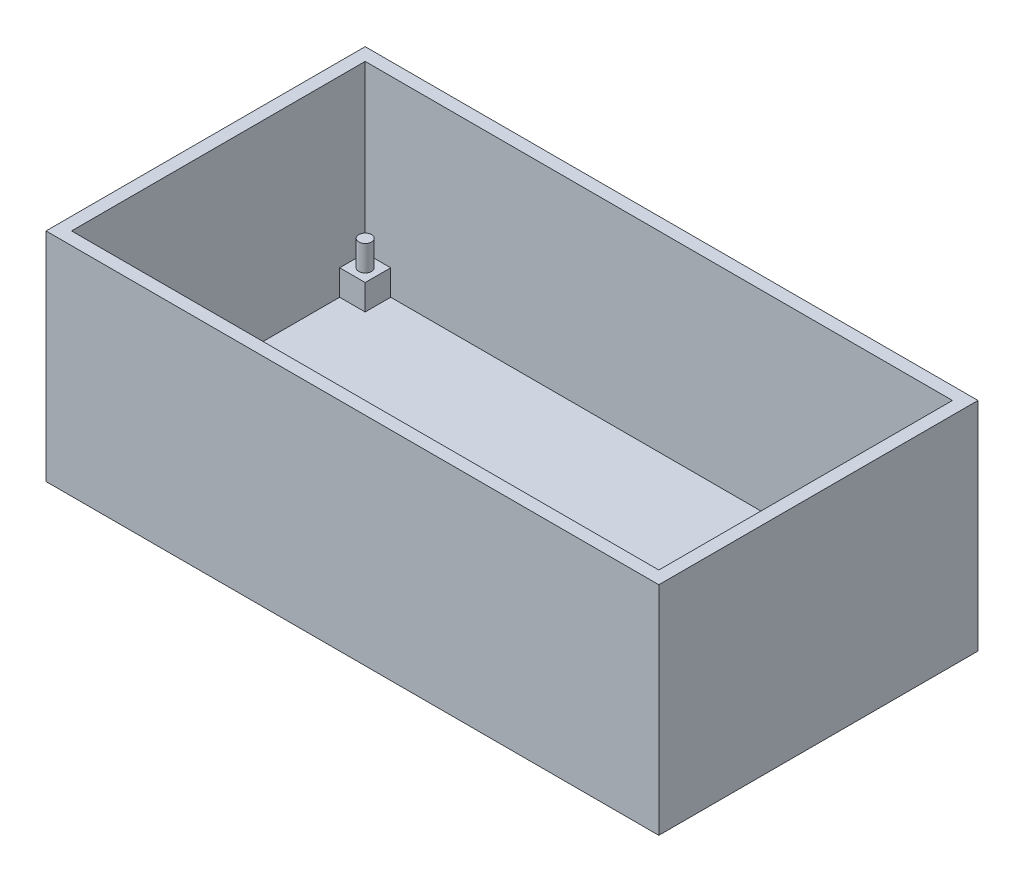
ISO-10303-21;
HEADER;
FILE_DESCRIPTION(('STEP AP214'),'2;1');
FILE_NAME('part.step','',(''),(''),'','','');
FILE_SCHEMA(('AUTOMOTIVE_DESIGN { 1 0 10303 214 1 1 1 1 }'));
ENDSEC;
DATA;
#1=APPLICATION_CONTEXT('core data for automotive mechanical design processes');
#2=APPLICATION_PROTOCOL_DEFINITION('international standard','automotive_design',2000,#1);
#3=PRODUCT_CONTEXT('',#1,'mechanical');
#4=PRODUCT('Part','Part','',(#3));
#5=PRODUCT_RELATED_PRODUCT_CATEGORY('part','',(#4));
#6=PRODUCT_DEFINITION_FORMATION('','',#4);
#7=PRODUCT_DEFINITION_CONTEXT('part definition',#1,'design');
#8=PRODUCT_DEFINITION('design','',#6,#7);
#9=PRODUCT_DEFINITION_SHAPE('','',#8);
#10=(LENGTH_UNIT() NAMED_UNIT(*) SI_UNIT(.MILLI.,.METRE.));
#11=(NAMED_UNIT(*) PLANE_ANGLE_UNIT() SI_UNIT($,.RADIAN.));
#12=(NAMED_UNIT(*) SI_UNIT($,.STERADIAN.) SOLID_ANGLE_UNIT());
#13=UNCERTAINTY_MEASURE_WITH_UNIT(LENGTH_MEASURE(1.E-05),#10,'distance_accuracy_value','');
#14=(GEOMETRIC_REPRESENTATION_CONTEXT(3) GLOBAL_UNCERTAINTY_ASSIGNED_CONTEXT((#13)) GLOBAL_UNIT_ASSIGNED_CONTEXT((#10,
#11,#12)) REPRESENTATION_CONTEXT('',''));
#15=CARTESIAN_POINT('',(0.,0.,0.));
#16=DIRECTION('',(0.,0.,1.));
#17=DIRECTION('',(1.,0.,0.));
#18=AXIS2_PLACEMENT_3D('',#15,#16,#17);
#19=CARTESIAN_POINT('',(0.,5.08,0.));
#20=DIRECTION('',(0.,-1.,0.));
#21=DIRECTION('',(0.,0.,-1.));
#22=AXIS2_PLACEMENT_3D('',#19,#20,#21);
#23=PLANE('',#22);
#24=DIRECTION('',(0.,0.,-1.));
#25=VECTOR('',#24,1.);
#26=CARTESIAN_POINT('',(7.62,5.08,-2.54));
#27=LINE('',#26,#25);
#28=CARTESIAN_POINT('',(7.62,5.08,-2.54));
#29=VERTEX_POINT('',#28);
#30=CARTESIAN_POINT('',(7.62,5.08,-7.62));
#31=VERTEX_POINT('',#30);
#32=EDGE_CURVE('E185',#29,#31,#27,.T.);
#33=ORIENTED_EDGE('',*,*,#32,.F.);
#34=DIRECTION('',(1.,0.,0.));
#35=VECTOR('',#34,1.);
#36=CARTESIAN_POINT('',(2.54000000000001,5.08,-2.54));
#37=LINE('',#36,#35);
#38=CARTESIAN_POINT('',(114.3,5.08,-2.54));
#39=VERTEX_POINT('',#38);
#40=EDGE_CURVE('E291',#29,#39,#37,.T.);
#41=ORIENTED_EDGE('',*,*,#40,.T.);
#42=DIRECTION('',(0.,0.,1.));
#43=VECTOR('',#42,1.);
#44=CARTESIAN_POINT('',(114.3,5.08,-2.53999999999997));
#45=LINE('',#44,#43);
#46=CARTESIAN_POINT('',(114.3,5.08,-7.61999999999997));
#47=VERTEX_POINT('',#46);
#48=EDGE_CURVE('E205',#47,#39,#45,.T.);
#49=ORIENTED_EDGE('',*,*,#48,.F.);
#50=DIRECTION('',(-1.,0.,0.));
#51=VECTOR('',#50,1.);
#52=CARTESIAN_POINT('',(119.38,5.08,-7.61999999999997));
#53=LINE('',#52,#51);
#54=CARTESIAN_POINT('',(119.38,5.08,-7.61999999999997));
#55=VERTEX_POINT('',#54);
#56=EDGE_CURVE('E200',#55,#47,#53,.T.);
#57=ORIENTED_EDGE('',*,*,#56,.F.);
#58=DIRECTION('',(0.,0.,-1.));
#59=VECTOR('',#58,1.);
#60=CARTESIAN_POINT('',(119.38,5.08,-60.96));
#61=LINE('',#60,#59);
#62=CARTESIAN_POINT('',(119.38,5.08,-55.88));
#63=VERTEX_POINT('',#62);
#64=EDGE_CURVE('E293',#55,#63,#61,.T.);
#65=ORIENTED_EDGE('',*,*,#64,.T.);
#66=DIRECTION('',(1.,0.,0.));
#67=VECTOR('',#66,1.);
#68=CARTESIAN_POINT('',(119.38,5.08,-55.88));
#69=LINE('',#68,#67);
#70=CARTESIAN_POINT('',(114.3,5.08,-55.88));
#71=VERTEX_POINT('',#70);
#72=EDGE_CURVE('E231',#71,#63,#69,.T.);
#73=ORIENTED_EDGE('',*,*,#72,.F.);
#74=DIRECTION('',(0.,0.,1.));
#75=VECTOR('',#74,1.);
#76=CARTESIAN_POINT('',(114.3,5.08,-60.96));
#77=LINE('',#76,#75);
#78=CARTESIAN_POINT('',(114.3,5.08,-60.96));
#79=VERTEX_POINT('',#78);
#80=EDGE_CURVE('E226',#79,#71,#77,.T.);
#81=ORIENTED_EDGE('',*,*,#80,.F.);
#82=DIRECTION('',(-1.,0.,0.));
#83=VECTOR('',#82,1.);
#84=CARTESIAN_POINT('',(2.54,5.08,-60.96));
#85=LINE('',#84,#83);
#86=CARTESIAN_POINT('',(7.62,5.08,-60.96));
#87=VERTEX_POINT('',#86);
#88=EDGE_CURVE('E282',#79,#87,#85,.T.);
#89=ORIENTED_EDGE('',*,*,#88,.T.);
#90=DIRECTION('',(0.,0.,-1.));
#91=VECTOR('',#90,1.);
#92=CARTESIAN_POINT('',(7.62,5.08,-60.96));
#93=LINE('',#92,#91);
#94=CARTESIAN_POINT('',(7.62,5.08,-55.88));
#95=VERTEX_POINT('',#94);
#96=EDGE_CURVE('E257',#95,#87,#93,.T.);
#97=ORIENTED_EDGE('',*,*,#96,.F.);
#98=DIRECTION('',(1.,0.,0.));
#99=VECTOR('',#98,1.);
#100=CARTESIAN_POINT('',(2.54,5.08,-55.88));
#101=LINE('',#100,#99);
#102=CARTESIAN_POINT('',(2.54,5.08,-55.88));
#103=VERTEX_POINT('',#102);
#104=EDGE_CURVE('E252',#103,#95,#101,.T.);
#105=ORIENTED_EDGE('',*,*,#104,.F.);
#106=DIRECTION('',(0.,0.,1.));
#107=VECTOR('',#106,1.);
#108=CARTESIAN_POINT('',(2.54,5.08,-60.96));
#109=LINE('',#108,#107);
#110=CARTESIAN_POINT('',(2.54000000000001,5.08,-7.62));
#111=VERTEX_POINT('',#110);
#112=EDGE_CURVE('E278',#103,#111,#109,.T.);
#113=ORIENTED_EDGE('',*,*,#112,.T.);
#114=DIRECTION('',(-1.,0.,0.));
#115=VECTOR('',#114,1.);
#116=CARTESIAN_POINT('',(2.54,5.08,-7.62));
#117=LINE('',#116,#115);
#118=EDGE_CURVE('E47',#31,#111,#117,.T.);
#119=ORIENTED_EDGE('',*,*,#118,.F.);
#120=EDGE_LOOP('',(#33,#41,#49,#57,#65,#73,#81,#89,#97,#105,#113,#119));
#121=FACE_BOUND('',#120,.T.);
#122=ADVANCED_FACE('F32',(#121),#23,.F.);
#123=CARTESIAN_POINT('',(2.54000000000001,43.18,-2.54));
#124=DIRECTION('',(0.,0.,-1.));
#125=DIRECTION('',(-1.,0.,0.));
#126=AXIS2_PLACEMENT_3D('',#123,#124,#125);
#127=PLANE('',#126);
#128=ORIENTED_EDGE('',*,*,#40,.F.);
#129=DIRECTION('',(0.,-1.,0.));
#130=VECTOR('',#129,1.);
#131=CARTESIAN_POINT('',(7.62,10.16,-2.54));
#132=LINE('',#131,#130);
#133=CARTESIAN_POINT('',(7.62,10.16,-2.54));
#134=VERTEX_POINT('',#133);
#135=EDGE_CURVE('E55',#134,#29,#132,.T.);
#136=ORIENTED_EDGE('',*,*,#135,.F.);
#137=DIRECTION('',(1.,0.,0.));
#138=VECTOR('',#137,1.);
#139=CARTESIAN_POINT('',(2.54,10.16,-2.54));
#140=LINE('',#139,#138);
#141=CARTESIAN_POINT('',(2.54,10.16,-2.54));
#142=VERTEX_POINT('',#141);
#143=EDGE_CURVE('E179',#142,#134,#140,.T.);
#144=ORIENTED_EDGE('',*,*,#143,.F.);
#145=DIRECTION('',(0.,-1.,0.));
#146=VECTOR('',#145,1.);
#147=CARTESIAN_POINT('',(2.54000000000001,43.18,-2.54));
#148=LINE('',#147,#146);
#149=CARTESIAN_POINT('',(2.54000000000001,43.18,-2.54));
#150=VERTEX_POINT('',#149);
#151=EDGE_CURVE('E302',#150,#142,#148,.T.);
#152=ORIENTED_EDGE('',*,*,#151,.F.);
#153=DIRECTION('',(1.,0.,0.));
#154=VECTOR('',#153,1.);
#155=CARTESIAN_POINT('',(2.54000000000001,43.18,-2.54));
#156=LINE('',#155,#154);
#157=CARTESIAN_POINT('',(119.38,43.18,-2.54));
#158=VERTEX_POINT('',#157);
#159=EDGE_CURVE('E281',#150,#158,#156,.T.);
#160=ORIENTED_EDGE('',*,*,#159,.T.);
#161=DIRECTION('',(0.,-1.,0.));
#162=VECTOR('',#161,1.);
#163=CARTESIAN_POINT('',(119.38,43.18,-2.54));
#164=LINE('',#163,#162);
#165=CARTESIAN_POINT('',(119.38,10.16,-2.53999999999997));
#166=VERTEX_POINT('',#165);
#167=EDGE_CURVE('E300',#158,#166,#164,.T.);
#168=ORIENTED_EDGE('',*,*,#167,.T.);
#169=DIRECTION('',(1.,0.,0.));
#170=VECTOR('',#169,1.);
#171=CARTESIAN_POINT('',(119.38,10.16,-2.53999999999997));
#172=LINE('',#171,#170);
#173=CARTESIAN_POINT('',(114.3,10.16,-2.54));
#174=VERTEX_POINT('',#173);
#175=EDGE_CURVE('E210',#174,#166,#172,.T.);
#176=ORIENTED_EDGE('',*,*,#175,.F.);
#177=DIRECTION('',(0.,-1.,0.));
#178=VECTOR('',#177,1.);
#179=CARTESIAN_POINT('',(114.3,10.16,-2.53999999999997));
#180=LINE('',#179,#178);
#181=EDGE_CURVE('E213',#174,#39,#180,.T.);
#182=ORIENTED_EDGE('',*,*,#181,.T.);
#183=EDGE_LOOP('',(#128,#136,#144,#152,#160,#168,#176,#182));
#184=FACE_BOUND('',#183,.T.);
#185=ADVANCED_FACE('F358',(#184),#127,.T.);
#186=CARTESIAN_POINT('',(2.54,43.18,-60.96));
#187=DIRECTION('',(1.,0.,0.));
#188=DIRECTION('',(0.,0.,-1.));
#189=AXIS2_PLACEMENT_3D('',#186,#187,#188);
#190=PLANE('',#189);
#191=DIRECTION('',(0.,0.,1.));
#192=VECTOR('',#191,1.);
#193=CARTESIAN_POINT('',(2.54,10.16,-2.54));
#194=LINE('',#193,#192);
#195=CARTESIAN_POINT('',(2.54000000000001,10.16,-7.62));
#196=VERTEX_POINT('',#195);
#197=EDGE_CURVE('E190',#196,#142,#194,.T.);
#198=ORIENTED_EDGE('',*,*,#197,.F.);
#199=DIRECTION('',(0.,-1.,0.));
#200=VECTOR('',#199,1.);
#201=CARTESIAN_POINT('',(2.54,10.16,-7.62));
#202=LINE('',#201,#200);
#203=EDGE_CURVE('E187',#196,#111,#202,.T.);
#204=ORIENTED_EDGE('',*,*,#203,.T.);
#205=ORIENTED_EDGE('',*,*,#112,.F.);
#206=DIRECTION('',(0.,-1.,0.));
#207=VECTOR('',#206,1.);
#208=CARTESIAN_POINT('',(2.54,10.16,-55.88));
#209=LINE('',#208,#207);
#210=CARTESIAN_POINT('',(2.54,10.16,-55.88));
#211=VERTEX_POINT('',#210);
#212=EDGE_CURVE('E275',#211,#103,#209,.T.);
#213=ORIENTED_EDGE('',*,*,#212,.F.);
#214=DIRECTION('',(0.,0.,1.));
#215=VECTOR('',#214,1.);
#216=CARTESIAN_POINT('',(2.54,10.16,-60.96));
#217=LINE('',#216,#215);
#218=CARTESIAN_POINT('',(2.54,10.16,-60.96));
#219=VERTEX_POINT('',#218);
#220=EDGE_CURVE('E253',#219,#211,#217,.T.);
#221=ORIENTED_EDGE('',*,*,#220,.F.);
#222=DIRECTION('',(0.,-1.,0.));
#223=VECTOR('',#222,1.);
#224=CARTESIAN_POINT('',(2.54,43.18,-60.96));
#225=LINE('',#224,#223);
#226=CARTESIAN_POINT('',(2.54,43.18,-60.96));
#227=VERTEX_POINT('',#226);
#228=EDGE_CURVE('E289',#227,#219,#225,.T.);
#229=ORIENTED_EDGE('',*,*,#228,.F.);
#230=DIRECTION('',(0.,0.,1.));
#231=VECTOR('',#230,1.);
#232=CARTESIAN_POINT('',(2.54,43.18,-60.96));
#233=LINE('',#232,#231);
#234=EDGE_CURVE('E279',#227,#150,#233,.T.);
#235=ORIENTED_EDGE('',*,*,#234,.T.);
#236=ORIENTED_EDGE('',*,*,#151,.T.);
#237=EDGE_LOOP('',(#198,#204,#205,#213,#221,#229,#235,#236));
#238=FACE_BOUND('',#237,.T.);
#239=ADVANCED_FACE('F363',(#238),#190,.T.);
#240=CARTESIAN_POINT('',(119.38,43.18,-60.96));
#241=DIRECTION('',(-1.,0.,0.));
#242=DIRECTION('',(0.,0.,1.));
#243=AXIS2_PLACEMENT_3D('',#240,#241,#242);
#244=PLANE('',#243);
#245=ORIENTED_EDGE('',*,*,#64,.F.);
#246=DIRECTION('',(0.,-1.,0.));
#247=VECTOR('',#246,1.);
#248=CARTESIAN_POINT('',(119.38,10.16,-7.61999999999997));
#249=LINE('',#248,#247);
#250=CARTESIAN_POINT('',(119.38,10.16,-7.61999999999997));
#251=VERTEX_POINT('',#250);
#252=EDGE_CURVE('E223',#251,#55,#249,.T.);
#253=ORIENTED_EDGE('',*,*,#252,.F.);
#254=DIRECTION('',(0.,0.,-1.));
#255=VECTOR('',#254,1.);
#256=CARTESIAN_POINT('',(119.38,10.16,-2.53999999999997));
#257=LINE('',#256,#255);
#258=EDGE_CURVE('E201',#166,#251,#257,.T.);
#259=ORIENTED_EDGE('',*,*,#258,.F.);
#260=ORIENTED_EDGE('',*,*,#167,.F.);
#261=DIRECTION('',(0.,0.,-1.));
#262=VECTOR('',#261,1.);
#263=CARTESIAN_POINT('',(119.38,43.18,-60.96));
#264=LINE('',#263,#262);
#265=CARTESIAN_POINT('',(119.38,43.18,-60.96));
#266=VERTEX_POINT('',#265);
#267=EDGE_CURVE('E284',#158,#266,#264,.T.);
#268=ORIENTED_EDGE('',*,*,#267,.T.);
#269=DIRECTION('',(0.,-1.,0.));
#270=VECTOR('',#269,1.);
#271=CARTESIAN_POINT('',(119.38,43.18,-60.96));
#272=LINE('',#271,#270);
#273=CARTESIAN_POINT('',(119.38,10.16,-60.96));
#274=VERTEX_POINT('',#273);
#275=EDGE_CURVE('E298',#266,#274,#272,.T.);
#276=ORIENTED_EDGE('',*,*,#275,.T.);
#277=DIRECTION('',(0.,0.,-1.));
#278=VECTOR('',#277,1.);
#279=CARTESIAN_POINT('',(119.38,10.16,-60.96));
#280=LINE('',#279,#278);
#281=CARTESIAN_POINT('',(119.38,10.16,-55.88));
#282=VERTEX_POINT('',#281);
#283=EDGE_CURVE('E236',#282,#274,#280,.T.);
#284=ORIENTED_EDGE('',*,*,#283,.F.);
#285=DIRECTION('',(0.,-1.,0.));
#286=VECTOR('',#285,1.);
#287=CARTESIAN_POINT('',(119.38,10.16,-55.88));
#288=LINE('',#287,#286);
#289=EDGE_CURVE('E239',#282,#63,#288,.T.);
#290=ORIENTED_EDGE('',*,*,#289,.T.);
#291=EDGE_LOOP('',(#245,#253,#259,#260,#268,#276,#284,#290));
#292=FACE_BOUND('',#291,.T.);
#293=ADVANCED_FACE('F598',(#292),#244,.T.);
#294=CARTESIAN_POINT('',(2.54,43.18,-60.96));
#295=DIRECTION('',(0.,0.,1.));
#296=DIRECTION('',(1.,0.,0.));
#297=AXIS2_PLACEMENT_3D('',#294,#295,#296);
#298=PLANE('',#297);
#299=ORIENTED_EDGE('',*,*,#88,.F.);
#300=DIRECTION('',(0.,-1.,0.));
#301=VECTOR('',#300,1.);
#302=CARTESIAN_POINT('',(114.3,10.16,-60.96));
#303=LINE('',#302,#301);
#304=CARTESIAN_POINT('',(114.3,10.16,-60.96));
#305=VERTEX_POINT('',#304);
#306=EDGE_CURVE('E249',#305,#79,#303,.T.);
#307=ORIENTED_EDGE('',*,*,#306,.F.);
#308=DIRECTION('',(-1.,0.,0.));
#309=VECTOR('',#308,1.);
#310=CARTESIAN_POINT('',(119.38,10.16,-60.96));
#311=LINE('',#310,#309);
#312=EDGE_CURVE('E227',#274,#305,#311,.T.);
#313=ORIENTED_EDGE('',*,*,#312,.F.);
#314=ORIENTED_EDGE('',*,*,#275,.F.);
#315=DIRECTION('',(-1.,0.,0.));
#316=VECTOR('',#315,1.);
#317=CARTESIAN_POINT('',(2.54,43.18,-60.96));
#318=LINE('',#317,#316);
#319=EDGE_CURVE('E287',#266,#227,#318,.T.);
#320=ORIENTED_EDGE('',*,*,#319,.T.);
#321=ORIENTED_EDGE('',*,*,#228,.T.);
#322=DIRECTION('',(-1.,0.,0.));
#323=VECTOR('',#322,1.);
#324=CARTESIAN_POINT('',(2.54,10.16,-60.96));
#325=LINE('',#324,#323);
#326=CARTESIAN_POINT('',(7.62,10.16,-60.96));
#327=VERTEX_POINT('',#326);
#328=EDGE_CURVE('E262',#327,#219,#325,.T.);
#329=ORIENTED_EDGE('',*,*,#328,.F.);
#330=DIRECTION('',(0.,-1.,0.));
#331=VECTOR('',#330,1.);
#332=CARTESIAN_POINT('',(7.62,10.16,-60.96));
#333=LINE('',#332,#331);
#334=EDGE_CURVE('E265',#327,#87,#333,.T.);
#335=ORIENTED_EDGE('',*,*,#334,.T.);
#336=EDGE_LOOP('',(#299,#307,#313,#314,#320,#321,#329,#335));
#337=FACE_BOUND('',#336,.T.);
#338=ADVANCED_FACE('F356',(#337),#298,.T.);
#339=CARTESIAN_POINT('',(0.,5.08,0.));
#340=DIRECTION('',(1.,0.,0.));
#341=DIRECTION('',(0.,0.,-1.));
#342=AXIS2_PLACEMENT_3D('',#339,#340,#341);
#343=PLANE('',#342);
#344=DIRECTION('',(0.,0.,1.));
#345=VECTOR('',#344,1.);
#346=CARTESIAN_POINT('',(0.,0.,0.));
#347=LINE('',#346,#345);
#348=CARTESIAN_POINT('',(0.,0.,-63.5));
#349=VERTEX_POINT('',#348);
#350=CARTESIAN_POINT('',(0.,0.,0.));
#351=VERTEX_POINT('',#350);
#352=EDGE_CURVE('E316',#349,#351,#347,.T.);
#353=ORIENTED_EDGE('',*,*,#352,.T.);
#354=DIRECTION('',(0.,-1.,0.));
#355=VECTOR('',#354,1.);
#356=CARTESIAN_POINT('',(0.,5.08,0.));
#357=LINE('',#356,#355);
#358=CARTESIAN_POINT('',(0.,43.18,0.));
#359=VERTEX_POINT('',#358);
#360=EDGE_CURVE('E11',#359,#351,#357,.T.);
#361=ORIENTED_EDGE('',*,*,#360,.F.);
#362=DIRECTION('',(0.,0.,1.));
#363=VECTOR('',#362,1.);
#364=CARTESIAN_POINT('',(0.,43.18,-63.5));
#365=LINE('',#364,#363);
#366=CARTESIAN_POINT('',(0.,43.18,-63.5));
#367=VERTEX_POINT('',#366);
#368=EDGE_CURVE('E304',#367,#359,#365,.T.);
#369=ORIENTED_EDGE('',*,*,#368,.F.);
#370=DIRECTION('',(0.,-1.,0.));
#371=VECTOR('',#370,1.);
#372=CARTESIAN_POINT('',(0.,5.08,-63.5));
#373=LINE('',#372,#371);
#374=EDGE_CURVE('E325',#367,#349,#373,.T.);
#375=ORIENTED_EDGE('',*,*,#374,.T.);
#376=EDGE_LOOP('',(#353,#361,#369,#375));
#377=FACE_BOUND('',#376,.T.);
#378=ADVANCED_FACE('F34',(#377),#343,.F.);
#379=CARTESIAN_POINT('',(0.,5.08,0.));
#380=DIRECTION('',(0.,0.,-1.));
#381=DIRECTION('',(-1.,0.,0.));
#382=AXIS2_PLACEMENT_3D('',#379,#380,#381);
#383=PLANE('',#382);
#384=DIRECTION('',(1.,0.,0.));
#385=VECTOR('',#384,1.);
#386=CARTESIAN_POINT('',(0.,0.,0.));
#387=LINE('',#386,#385);
#388=CARTESIAN_POINT('',(121.92,0.,0.));
#389=VERTEX_POINT('',#388);
#390=EDGE_CURVE('E319',#351,#389,#387,.T.);
#391=ORIENTED_EDGE('',*,*,#390,.T.);
#392=DIRECTION('',(0.,-1.,0.));
#393=VECTOR('',#392,1.);
#394=CARTESIAN_POINT('',(121.92,5.08,0.));
#395=LINE('',#394,#393);
#396=CARTESIAN_POINT('',(121.92,43.18,0.));
#397=VERTEX_POINT('',#396);
#398=EDGE_CURVE('E40',#397,#389,#395,.T.);
#399=ORIENTED_EDGE('',*,*,#398,.F.);
#400=DIRECTION('',(1.,0.,0.));
#401=VECTOR('',#400,1.);
#402=CARTESIAN_POINT('',(0.,43.18,0.));
#403=LINE('',#402,#401);
#404=EDGE_CURVE('E307',#359,#397,#403,.T.);
#405=ORIENTED_EDGE('',*,*,#404,.F.);
#406=ORIENTED_EDGE('',*,*,#360,.T.);
#407=EDGE_LOOP('',(#391,#399,#405,#406));
#408=FACE_BOUND('',#407,.T.);
#409=ADVANCED_FACE('F349',(#408),#383,.F.);
#410=CARTESIAN_POINT('',(121.92,5.08,0.));
#411=DIRECTION('',(-1.,0.,0.));
#412=DIRECTION('',(0.,0.,1.));
#413=AXIS2_PLACEMENT_3D('',#410,#411,#412);
#414=PLANE('',#413);
#415=DIRECTION('',(0.,0.,-1.));
#416=VECTOR('',#415,1.);
#417=CARTESIAN_POINT('',(121.92,0.,0.));
#418=LINE('',#417,#416);
#419=CARTESIAN_POINT('',(121.92,0.,-63.5));
#420=VERTEX_POINT('',#419);
#421=EDGE_CURVE('E321',#389,#420,#418,.T.);
#422=ORIENTED_EDGE('',*,*,#421,.T.);
#423=DIRECTION('',(0.,-1.,0.));
#424=VECTOR('',#423,1.);
#425=CARTESIAN_POINT('',(121.92,5.08,-63.5));
#426=LINE('',#425,#424);
#427=CARTESIAN_POINT('',(121.92,43.18,-63.5));
#428=VERTEX_POINT('',#427);
#429=EDGE_CURVE('E328',#428,#420,#426,.T.);
#430=ORIENTED_EDGE('',*,*,#429,.F.);
#431=DIRECTION('',(0.,0.,-1.));
#432=VECTOR('',#431,1.);
#433=CARTESIAN_POINT('',(121.92,43.18,-63.5));
#434=LINE('',#433,#432);
#435=EDGE_CURVE('E310',#397,#428,#434,.T.);
#436=ORIENTED_EDGE('',*,*,#435,.F.);
#437=ORIENTED_EDGE('',*,*,#398,.T.);
#438=EDGE_LOOP('',(#422,#430,#436,#437));
#439=FACE_BOUND('',#438,.T.);
#440=ADVANCED_FACE('F334',(#439),#414,.F.);
#441=CARTESIAN_POINT('',(0.,5.08,-63.5));
#442=DIRECTION('',(0.,0.,1.));
#443=DIRECTION('',(1.,0.,0.));
#444=AXIS2_PLACEMENT_3D('',#441,#442,#443);
#445=PLANE('',#444);
#446=DIRECTION('',(-1.,0.,0.));
#447=VECTOR('',#446,1.);
#448=CARTESIAN_POINT('',(0.,0.,-63.5));
#449=LINE('',#448,#447);
#450=EDGE_CURVE('E323',#420,#349,#449,.T.);
#451=ORIENTED_EDGE('',*,*,#450,.T.);
#452=ORIENTED_EDGE('',*,*,#374,.F.);
#453=DIRECTION('',(-1.,0.,0.));
#454=VECTOR('',#453,1.);
#455=CARTESIAN_POINT('',(0.,43.18,-63.5));
#456=LINE('',#455,#454);
#457=EDGE_CURVE('E313',#428,#367,#456,.T.);
#458=ORIENTED_EDGE('',*,*,#457,.F.);
#459=ORIENTED_EDGE('',*,*,#429,.T.);
#460=EDGE_LOOP('',(#451,#452,#458,#459));
#461=FACE_BOUND('',#460,.T.);
#462=ADVANCED_FACE('F342',(#461),#445,.F.);
#463=CARTESIAN_POINT('',(0.,0.,0.));
#464=DIRECTION('',(0.,-1.,0.));
#465=DIRECTION('',(0.,0.,-1.));
#466=AXIS2_PLACEMENT_3D('',#463,#464,#465);
#467=PLANE('',#466);
#468=ORIENTED_EDGE('',*,*,#352,.F.);
#469=ORIENTED_EDGE('',*,*,#450,.F.);
#470=ORIENTED_EDGE('',*,*,#421,.F.);
#471=ORIENTED_EDGE('',*,*,#390,.F.);
#472=EDGE_LOOP('',(#468,#469,#470,#471));
#473=FACE_BOUND('',#472,.T.);
#474=ADVANCED_FACE('F340',(#473),#467,.T.);
#475=CARTESIAN_POINT('',(0.,43.18,0.));
#476=DIRECTION('',(0.,1.,0.));
#477=DIRECTION('',(0.,0.,1.));
#478=AXIS2_PLACEMENT_3D('',#475,#476,#477);
#479=PLANE('',#478);
#480=ORIENTED_EDGE('',*,*,#368,.T.);
#481=ORIENTED_EDGE('',*,*,#404,.T.);
#482=ORIENTED_EDGE('',*,*,#435,.T.);
#483=ORIENTED_EDGE('',*,*,#457,.T.);
#484=EDGE_LOOP('',(#480,#481,#482,#483));
#485=FACE_BOUND('',#484,.T.);
#486=ORIENTED_EDGE('',*,*,#159,.F.);
#487=ORIENTED_EDGE('',*,*,#234,.F.);
#488=ORIENTED_EDGE('',*,*,#319,.F.);
#489=ORIENTED_EDGE('',*,*,#267,.F.);
#490=EDGE_LOOP('',(#486,#487,#488,#489));
#491=FACE_BOUND('',#490,.T.);
#492=ADVANCED_FACE('F347',(#485,#491),#479,.T.);
#493=CARTESIAN_POINT('',(2.54,10.16,-55.88));
#494=DIRECTION('',(0.,0.,-1.));
#495=DIRECTION('',(-1.,0.,0.));
#496=AXIS2_PLACEMENT_3D('',#493,#494,#495);
#497=PLANE('',#496);
#498=ORIENTED_EDGE('',*,*,#104,.T.);
#499=DIRECTION('',(0.,-1.,0.));
#500=VECTOR('',#499,1.);
#501=CARTESIAN_POINT('',(7.62,10.16,-55.88));
#502=LINE('',#501,#500);
#503=CARTESIAN_POINT('',(7.62,10.16,-55.88));
#504=VERTEX_POINT('',#503);
#505=EDGE_CURVE('E272',#504,#95,#502,.T.);
#506=ORIENTED_EDGE('',*,*,#505,.F.);
#507=DIRECTION('',(1.,0.,0.));
#508=VECTOR('',#507,1.);
#509=CARTESIAN_POINT('',(2.54,10.16,-55.88));
#510=LINE('',#509,#508);
#511=EDGE_CURVE('E256',#211,#504,#510,.T.);
#512=ORIENTED_EDGE('',*,*,#511,.F.);
#513=ORIENTED_EDGE('',*,*,#212,.T.);
#514=EDGE_LOOP('',(#498,#506,#512,#513));
#515=FACE_BOUND('',#514,.T.);
#516=ADVANCED_FACE('F386',(#515),#497,.F.);
#517=CARTESIAN_POINT('',(7.62,10.16,-60.96));
#518=DIRECTION('',(-1.,0.,0.));
#519=DIRECTION('',(0.,0.,1.));
#520=AXIS2_PLACEMENT_3D('',#517,#518,#519);
#521=PLANE('',#520);
#522=ORIENTED_EDGE('',*,*,#96,.T.);
#523=ORIENTED_EDGE('',*,*,#334,.F.);
#524=DIRECTION('',(0.,0.,-1.));
#525=VECTOR('',#524,1.);
#526=CARTESIAN_POINT('',(7.62,10.16,-60.96));
#527=LINE('',#526,#525);
#528=EDGE_CURVE('E259',#504,#327,#527,.T.);
#529=ORIENTED_EDGE('',*,*,#528,.F.);
#530=ORIENTED_EDGE('',*,*,#505,.T.);
#531=EDGE_LOOP('',(#522,#523,#529,#530));
#532=FACE_BOUND('',#531,.T.);
#533=ADVANCED_FACE('F392',(#532),#521,.F.);
#534=CARTESIAN_POINT('',(0.,10.16,0.));
#535=DIRECTION('',(0.,1.,0.));
#536=DIRECTION('',(0.,0.,1.));
#537=AXIS2_PLACEMENT_3D('',#534,#535,#536);
#538=PLANE('',#537);
#539=CARTESIAN_POINT('',(5.08,10.16,-58.42));
#540=DIRECTION('',(0.,1.,0.));
#541=DIRECTION('',(0.,0.,1.));
#542=AXIS2_PLACEMENT_3D('',#539,#540,#541);
#543=CIRCLE('',#542,1.27);
#544=CARTESIAN_POINT('',(5.08,10.16,-57.15));
#545=VERTEX_POINT('',#544);
#546=EDGE_CURVE('E672',#545,#545,#543,.T.);
#547=ORIENTED_EDGE('',*,*,#546,.F.);
#548=EDGE_LOOP('',(#547));
#549=FACE_BOUND('',#548,.T.);
#550=ORIENTED_EDGE('',*,*,#220,.T.);
#551=ORIENTED_EDGE('',*,*,#511,.T.);
#552=ORIENTED_EDGE('',*,*,#528,.T.);
#553=ORIENTED_EDGE('',*,*,#328,.T.);
#554=EDGE_LOOP('',(#550,#551,#552,#553));
#555=FACE_BOUND('',#554,.T.);
#556=ADVANCED_FACE('F401',(#549,#555),#538,.T.);
#557=CARTESIAN_POINT('',(114.3,10.16,-60.96));
#558=DIRECTION('',(1.,0.,0.));
#559=DIRECTION('',(0.,0.,-1.));
#560=AXIS2_PLACEMENT_3D('',#557,#558,#559);
#561=PLANE('',#560);
#562=ORIENTED_EDGE('',*,*,#80,.T.);
#563=DIRECTION('',(0.,-1.,0.));
#564=VECTOR('',#563,1.);
#565=CARTESIAN_POINT('',(114.3,10.16,-55.88));
#566=LINE('',#565,#564);
#567=CARTESIAN_POINT('',(114.3,10.16,-55.88));
#568=VERTEX_POINT('',#567);
#569=EDGE_CURVE('E246',#568,#71,#566,.T.);
#570=ORIENTED_EDGE('',*,*,#569,.F.);
#571=DIRECTION('',(0.,0.,1.));
#572=VECTOR('',#571,1.);
#573=CARTESIAN_POINT('',(114.3,10.16,-60.96));
#574=LINE('',#573,#572);
#575=EDGE_CURVE('E230',#305,#568,#574,.T.);
#576=ORIENTED_EDGE('',*,*,#575,.F.);
#577=ORIENTED_EDGE('',*,*,#306,.T.);
#578=EDGE_LOOP('',(#562,#570,#576,#577));
#579=FACE_BOUND('',#578,.T.);
#580=ADVANCED_FACE('F410',(#579),#561,.F.);
#581=CARTESIAN_POINT('',(119.38,10.16,-55.88));
#582=DIRECTION('',(0.,0.,-1.));
#583=DIRECTION('',(-1.,0.,0.));
#584=AXIS2_PLACEMENT_3D('',#581,#582,#583);
#585=PLANE('',#584);
#586=ORIENTED_EDGE('',*,*,#72,.T.);
#587=ORIENTED_EDGE('',*,*,#289,.F.);
#588=DIRECTION('',(1.,0.,0.));
#589=VECTOR('',#588,1.);
#590=CARTESIAN_POINT('',(119.38,10.16,-55.88));
#591=LINE('',#590,#589);
#592=EDGE_CURVE('E233',#568,#282,#591,.T.);
#593=ORIENTED_EDGE('',*,*,#592,.F.);
#594=ORIENTED_EDGE('',*,*,#569,.T.);
#595=EDGE_LOOP('',(#586,#587,#593,#594));
#596=FACE_BOUND('',#595,.T.);
#597=ADVANCED_FACE('F419',(#596),#585,.F.);
#598=CARTESIAN_POINT('',(0.,10.16,0.));
#599=DIRECTION('',(0.,1.,0.));
#600=DIRECTION('',(0.,0.,1.));
#601=AXIS2_PLACEMENT_3D('',#598,#599,#600);
#602=PLANE('',#601);
#603=CARTESIAN_POINT('',(116.84,10.16,-58.42));
#604=DIRECTION('',(0.,1.,0.));
#605=DIRECTION('',(0.,0.,1.));
#606=AXIS2_PLACEMENT_3D('',#603,#604,#605);
#607=CIRCLE('',#606,1.26999999999999);
#608=CARTESIAN_POINT('',(116.84,10.16,-57.15));
#609=VERTEX_POINT('',#608);
#610=EDGE_CURVE('E678',#609,#609,#607,.T.);
#611=ORIENTED_EDGE('',*,*,#610,.F.);
#612=EDGE_LOOP('',(#611));
#613=FACE_BOUND('',#612,.T.);
#614=ORIENTED_EDGE('',*,*,#312,.T.);
#615=ORIENTED_EDGE('',*,*,#575,.T.);
#616=ORIENTED_EDGE('',*,*,#592,.T.);
#617=ORIENTED_EDGE('',*,*,#283,.T.);
#618=EDGE_LOOP('',(#614,#615,#616,#617));
#619=FACE_BOUND('',#618,.T.);
#620=ADVANCED_FACE('F427',(#613,#619),#602,.T.);
#621=CARTESIAN_POINT('',(119.38,10.16,-7.61999999999997));
#622=DIRECTION('',(0.,0.,1.));
#623=DIRECTION('',(1.,0.,0.));
#624=AXIS2_PLACEMENT_3D('',#621,#622,#623);
#625=PLANE('',#624);
#626=ORIENTED_EDGE('',*,*,#56,.T.);
#627=DIRECTION('',(0.,-1.,0.));
#628=VECTOR('',#627,1.);
#629=CARTESIAN_POINT('',(114.3,10.16,-7.61999999999997));
#630=LINE('',#629,#628);
#631=CARTESIAN_POINT('',(114.3,10.16,-7.61999999999997));
#632=VERTEX_POINT('',#631);
#633=EDGE_CURVE('E220',#632,#47,#630,.T.);
#634=ORIENTED_EDGE('',*,*,#633,.F.);
#635=DIRECTION('',(-1.,0.,0.));
#636=VECTOR('',#635,1.);
#637=CARTESIAN_POINT('',(119.38,10.16,-7.61999999999997));
#638=LINE('',#637,#636);
#639=EDGE_CURVE('E204',#251,#632,#638,.T.);
#640=ORIENTED_EDGE('',*,*,#639,.F.);
#641=ORIENTED_EDGE('',*,*,#252,.T.);
#642=EDGE_LOOP('',(#626,#634,#640,#641));
#643=FACE_BOUND('',#642,.T.);
#644=ADVANCED_FACE('F435',(#643),#625,.F.);
#645=CARTESIAN_POINT('',(114.3,10.16,-2.53999999999997));
#646=DIRECTION('',(1.,0.,0.));
#647=DIRECTION('',(0.,0.,-1.));
#648=AXIS2_PLACEMENT_3D('',#645,#646,#647);
#649=PLANE('',#648);
#650=ORIENTED_EDGE('',*,*,#48,.T.);
#651=ORIENTED_EDGE('',*,*,#181,.F.);
#652=DIRECTION('',(0.,0.,1.));
#653=VECTOR('',#652,1.);
#654=CARTESIAN_POINT('',(114.3,10.16,-2.53999999999997));
#655=LINE('',#654,#653);
#656=EDGE_CURVE('E207',#632,#174,#655,.T.);
#657=ORIENTED_EDGE('',*,*,#656,.F.);
#658=ORIENTED_EDGE('',*,*,#633,.T.);
#659=EDGE_LOOP('',(#650,#651,#657,#658));
#660=FACE_BOUND('',#659,.T.);
#661=ADVANCED_FACE('F443',(#660),#649,.F.);
#662=CARTESIAN_POINT('',(0.,10.16,0.));
#663=DIRECTION('',(0.,1.,0.));
#664=DIRECTION('',(0.,0.,1.));
#665=AXIS2_PLACEMENT_3D('',#662,#663,#664);
#666=PLANE('',#665);
#667=CARTESIAN_POINT('',(116.84,10.16,-5.08));
#668=DIRECTION('',(0.,1.,0.));
#669=DIRECTION('',(0.,0.,1.));
#670=AXIS2_PLACEMENT_3D('',#667,#668,#669);
#671=CIRCLE('',#670,1.26999999999999);
#672=CARTESIAN_POINT('',(116.84,10.16,-3.81000000000001));
#673=VERTEX_POINT('',#672);
#674=EDGE_CURVE('E684',#673,#673,#671,.T.);
#675=ORIENTED_EDGE('',*,*,#674,.F.);
#676=EDGE_LOOP('',(#675));
#677=FACE_BOUND('',#676,.T.);
#678=ORIENTED_EDGE('',*,*,#258,.T.);
#679=ORIENTED_EDGE('',*,*,#639,.T.);
#680=ORIENTED_EDGE('',*,*,#656,.T.);
#681=ORIENTED_EDGE('',*,*,#175,.T.);
#682=EDGE_LOOP('',(#678,#679,#680,#681));
#683=FACE_BOUND('',#682,.T.);
#684=ADVANCED_FACE('F451',(#677,#683),#666,.T.);
#685=CARTESIAN_POINT('',(7.62,10.16,-2.54));
#686=DIRECTION('',(-1.,0.,0.));
#687=DIRECTION('',(0.,0.,1.));
#688=AXIS2_PLACEMENT_3D('',#685,#686,#687);
#689=PLANE('',#688);
#690=ORIENTED_EDGE('',*,*,#32,.T.);
#691=DIRECTION('',(0.,-1.,0.));
#692=VECTOR('',#691,1.);
#693=CARTESIAN_POINT('',(7.62,10.16,-7.62));
#694=LINE('',#693,#692);
#695=CARTESIAN_POINT('',(7.62,10.16,-7.62));
#696=VERTEX_POINT('',#695);
#697=EDGE_CURVE('E183',#696,#31,#694,.T.);
#698=ORIENTED_EDGE('',*,*,#697,.F.);
#699=DIRECTION('',(0.,0.,-1.));
#700=VECTOR('',#699,1.);
#701=CARTESIAN_POINT('',(7.62,10.16,-2.54));
#702=LINE('',#701,#700);
#703=EDGE_CURVE('E172',#134,#696,#702,.T.);
#704=ORIENTED_EDGE('',*,*,#703,.F.);
#705=ORIENTED_EDGE('',*,*,#135,.T.);
#706=EDGE_LOOP('',(#690,#698,#704,#705));
#707=FACE_BOUND('',#706,.T.);
#708=ADVANCED_FACE('F184',(#707),#689,.F.);
#709=CARTESIAN_POINT('',(2.54,10.16,-7.62));
#710=DIRECTION('',(0.,0.,1.));
#711=DIRECTION('',(1.,0.,0.));
#712=AXIS2_PLACEMENT_3D('',#709,#710,#711);
#713=PLANE('',#712);
#714=ORIENTED_EDGE('',*,*,#118,.T.);
#715=ORIENTED_EDGE('',*,*,#203,.F.);
#716=DIRECTION('',(-1.,0.,0.));
#717=VECTOR('',#716,1.);
#718=CARTESIAN_POINT('',(2.54,10.16,-7.62));
#719=LINE('',#718,#717);
#720=EDGE_CURVE('E177',#696,#196,#719,.T.);
#721=ORIENTED_EDGE('',*,*,#720,.F.);
#722=ORIENTED_EDGE('',*,*,#697,.T.);
#723=EDGE_LOOP('',(#714,#715,#721,#722));
#724=FACE_BOUND('',#723,.T.);
#725=ADVANCED_FACE('F189',(#724),#713,.F.);
#726=CARTESIAN_POINT('',(0.,10.16,0.));
#727=DIRECTION('',(0.,1.,0.));
#728=DIRECTION('',(0.,0.,1.));
#729=AXIS2_PLACEMENT_3D('',#726,#727,#728);
#730=PLANE('',#729);
#731=CARTESIAN_POINT('',(5.08,10.16,-5.08));
#732=DIRECTION('',(0.,1.,0.));
#733=DIRECTION('',(0.,0.,1.));
#734=AXIS2_PLACEMENT_3D('',#731,#732,#733);
#735=CIRCLE('',#734,1.27);
#736=CARTESIAN_POINT('',(5.08,10.16,-3.81));
#737=VERTEX_POINT('',#736);
#738=EDGE_CURVE('E690',#737,#737,#735,.T.);
#739=ORIENTED_EDGE('',*,*,#738,.F.);
#740=EDGE_LOOP('',(#739));
#741=FACE_BOUND('',#740,.T.);
#742=ORIENTED_EDGE('',*,*,#143,.T.);
#743=ORIENTED_EDGE('',*,*,#703,.T.);
#744=ORIENTED_EDGE('',*,*,#720,.T.);
#745=ORIENTED_EDGE('',*,*,#197,.T.);
#746=EDGE_LOOP('',(#742,#743,#744,#745));
#747=FACE_BOUND('',#746,.T.);
#748=ADVANCED_FACE('F174',(#741,#747),#730,.T.);
#749=CARTESIAN_POINT('',(5.08,15.24,-58.42));
#750=DIRECTION('',(0.,-1.,0.));
#751=DIRECTION('',(0.,0.,-1.));
#752=AXIS2_PLACEMENT_3D('',#749,#750,#751);
#753=CYLINDRICAL_SURFACE('',#752,1.27);
#754=CARTESIAN_POINT('',(5.08,15.24,-58.42));
#755=DIRECTION('',(0.,1.,0.));
#756=DIRECTION('',(0.,0.,1.));
#757=AXIS2_PLACEMENT_3D('',#754,#755,#756);
#758=CIRCLE('',#757,1.27);
#759=CARTESIAN_POINT('',(5.08,15.24,-57.15));
#760=VERTEX_POINT('',#759);
#761=EDGE_CURVE('E196',#760,#760,#758,.T.);
#762=ORIENTED_EDGE('',*,*,#761,.F.);
#763=EDGE_LOOP('',(#762));
#764=FACE_BOUND('',#763,.T.);
#765=ORIENTED_EDGE('',*,*,#546,.T.);
#766=EDGE_LOOP('',(#765));
#767=FACE_BOUND('',#766,.T.);
#768=ADVANCED_FACE('F476',(#764,#767),#753,.T.);
#769=CARTESIAN_POINT('',(5.08,15.24,-58.42));
#770=DIRECTION('',(0.,1.,0.));
#771=DIRECTION('',(0.,0.,1.));
#772=AXIS2_PLACEMENT_3D('',#769,#770,#771);
#773=PLANE('',#772);
#774=ORIENTED_EDGE('',*,*,#761,.T.);
#775=EDGE_LOOP('',(#774));
#776=FACE_BOUND('',#775,.T.);
#777=ADVANCED_FACE('F484',(#776),#773,.T.);
#778=CARTESIAN_POINT('',(116.84,15.24,-58.42));
#779=DIRECTION('',(0.,-1.,0.));
#780=DIRECTION('',(0.,0.,-1.));
#781=AXIS2_PLACEMENT_3D('',#778,#779,#780);
#782=CYLINDRICAL_SURFACE('',#781,1.26999999999999);
#783=CARTESIAN_POINT('',(116.84,15.24,-58.42));
#784=DIRECTION('',(0.,1.,0.));
#785=DIRECTION('',(0.,0.,1.));
#786=AXIS2_PLACEMENT_3D('',#783,#784,#785);
#787=CIRCLE('',#786,1.26999999999999);
#788=CARTESIAN_POINT('',(116.84,15.24,-57.15));
#789=VERTEX_POINT('',#788);
#790=EDGE_CURVE('E675',#789,#789,#787,.T.);
#791=ORIENTED_EDGE('',*,*,#790,.F.);
#792=EDGE_LOOP('',(#791));
#793=FACE_BOUND('',#792,.T.);
#794=ORIENTED_EDGE('',*,*,#610,.T.);
#795=EDGE_LOOP('',(#794));
#796=FACE_BOUND('',#795,.T.);
#797=ADVANCED_FACE('F492',(#793,#796),#782,.T.);
#798=CARTESIAN_POINT('',(116.84,15.24,-58.42));
#799=DIRECTION('',(0.,1.,0.));
#800=DIRECTION('',(0.,0.,1.));
#801=AXIS2_PLACEMENT_3D('',#798,#799,#800);
#802=PLANE('',#801);
#803=ORIENTED_EDGE('',*,*,#790,.T.);
#804=EDGE_LOOP('',(#803));
#805=FACE_BOUND('',#804,.T.);
#806=ADVANCED_FACE('F500',(#805),#802,.T.);
#807=CARTESIAN_POINT('',(116.84,15.24,-5.08));
#808=DIRECTION('',(0.,-1.,0.));
#809=DIRECTION('',(0.,0.,-1.));
#810=AXIS2_PLACEMENT_3D('',#807,#808,#809);
#811=CYLINDRICAL_SURFACE('',#810,1.26999999999999);
#812=CARTESIAN_POINT('',(116.84,15.24,-5.08));
#813=DIRECTION('',(0.,1.,0.));
#814=DIRECTION('',(0.,0.,1.));
#815=AXIS2_PLACEMENT_3D('',#812,#813,#814);
#816=CIRCLE('',#815,1.26999999999999);
#817=CARTESIAN_POINT('',(116.84,15.24,-3.81000000000001));
#818=VERTEX_POINT('',#817);
#819=EDGE_CURVE('E681',#818,#818,#816,.T.);
#820=ORIENTED_EDGE('',*,*,#819,.F.);
#821=EDGE_LOOP('',(#820));
#822=FACE_BOUND('',#821,.T.);
#823=ORIENTED_EDGE('',*,*,#674,.T.);
#824=EDGE_LOOP('',(#823));
#825=FACE_BOUND('',#824,.T.);
#826=ADVANCED_FACE('F508',(#822,#825),#811,.T.);
#827=CARTESIAN_POINT('',(116.84,15.24,-5.08));
#828=DIRECTION('',(0.,1.,0.));
#829=DIRECTION('',(0.,0.,1.));
#830=AXIS2_PLACEMENT_3D('',#827,#828,#829);
#831=PLANE('',#830);
#832=ORIENTED_EDGE('',*,*,#819,.T.);
#833=EDGE_LOOP('',(#832));
#834=FACE_BOUND('',#833,.T.);
#835=ADVANCED_FACE('F516',(#834),#831,.T.);
#836=CARTESIAN_POINT('',(5.08,15.24,-5.08));
#837=DIRECTION('',(0.,-1.,0.));
#838=DIRECTION('',(0.,0.,-1.));
#839=AXIS2_PLACEMENT_3D('',#836,#837,#838);
#840=CYLINDRICAL_SURFACE('',#839,1.27);
#841=CARTESIAN_POINT('',(5.08,15.24,-5.08));
#842=DIRECTION('',(0.,1.,0.));
#843=DIRECTION('',(0.,0.,1.));
#844=AXIS2_PLACEMENT_3D('',#841,#842,#843);
#845=CIRCLE('',#844,1.27);
#846=CARTESIAN_POINT('',(5.08,15.24,-3.81));
#847=VERTEX_POINT('',#846);
#848=EDGE_CURVE('E687',#847,#847,#845,.T.);
#849=ORIENTED_EDGE('',*,*,#848,.F.);
#850=EDGE_LOOP('',(#849));
#851=FACE_BOUND('',#850,.T.);
#852=ORIENTED_EDGE('',*,*,#738,.T.);
#853=EDGE_LOOP('',(#852));
#854=FACE_BOUND('',#853,.T.);
#855=ADVANCED_FACE('F524',(#851,#854),#840,.T.);
#856=CARTESIAN_POINT('',(5.08,15.24,-5.08));
#857=DIRECTION('',(0.,1.,0.));
#858=DIRECTION('',(0.,0.,1.));
#859=AXIS2_PLACEMENT_3D('',#856,#857,#858);
#860=PLANE('',#859);
#861=ORIENTED_EDGE('',*,*,#848,.T.);
#862=EDGE_LOOP('',(#861));
#863=FACE_BOUND('',#862,.T.);
#864=ADVANCED_FACE('F532',(#863),#860,.T.);
#865=CLOSED_SHELL('',(#122,#185,#239,#293,#338,#378,#409,#440,#462,#474,#492,#516,#533,#556,
#580,#597,#620,#644,#661,#684,#708,#725,#748,#768,#777,#797,#806,#826,#835,#855,#864));
#866=MANIFOLD_SOLID_BREP('B2',#865);
#867=ADVANCED_BREP_SHAPE_REPRESENTATION('',(#18,#866),#14);
#868=SHAPE_DEFINITION_REPRESENTATION(#9,#867);
ENDSEC;
END-ISO-10303-21;
